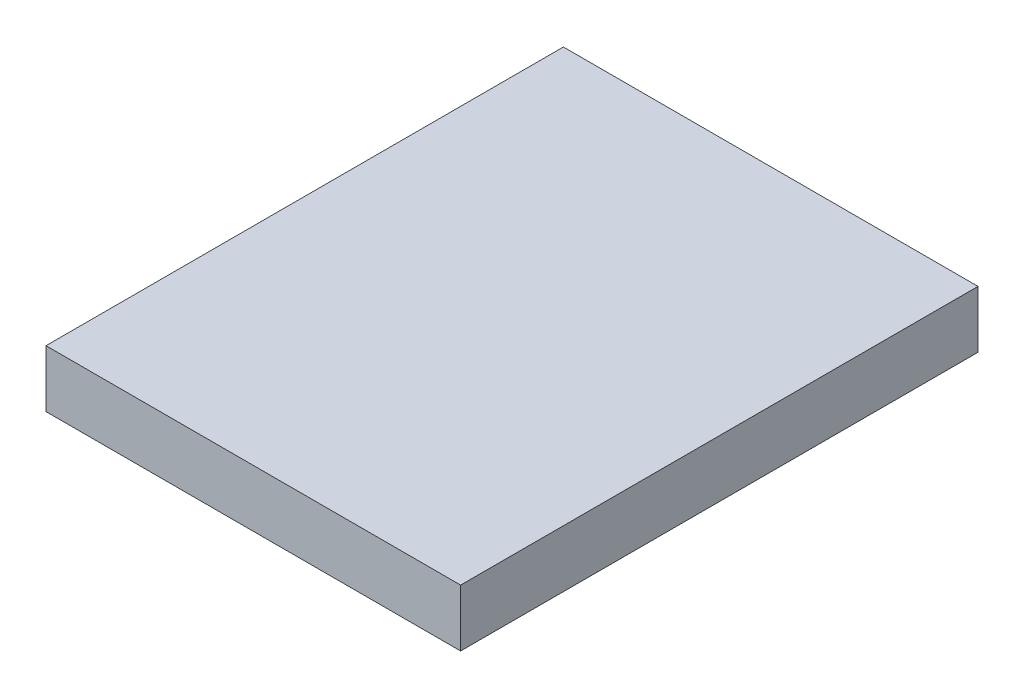
ISO-10303-21;
HEADER;
FILE_DESCRIPTION(('STEP AP214'),'2;1');
FILE_NAME('part.step','',(''),(''),'','','');
FILE_SCHEMA(('AUTOMOTIVE_DESIGN { 1 0 10303 214 1 1 1 1 }'));
ENDSEC;
DATA;
#1=APPLICATION_CONTEXT('core data for automotive mechanical design processes');
#2=APPLICATION_PROTOCOL_DEFINITION('international standard','automotive_design',2000,#1);
#3=PRODUCT_CONTEXT('',#1,'mechanical');
#4=PRODUCT('Part','Part','',(#3));
#5=PRODUCT_RELATED_PRODUCT_CATEGORY('part','',(#4));
#6=PRODUCT_DEFINITION_FORMATION('','',#4);
#7=PRODUCT_DEFINITION_CONTEXT('part definition',#1,'design');
#8=PRODUCT_DEFINITION('design','',#6,#7);
#9=PRODUCT_DEFINITION_SHAPE('','',#8);
#10=(LENGTH_UNIT() NAMED_UNIT(*) SI_UNIT(.MILLI.,.METRE.));
#11=(NAMED_UNIT(*) PLANE_ANGLE_UNIT() SI_UNIT($,.RADIAN.));
#12=(NAMED_UNIT(*) SI_UNIT($,.STERADIAN.) SOLID_ANGLE_UNIT());
#13=UNCERTAINTY_MEASURE_WITH_UNIT(LENGTH_MEASURE(1.E-05),#10,'distance_accuracy_value','');
#14=(GEOMETRIC_REPRESENTATION_CONTEXT(3) GLOBAL_UNCERTAINTY_ASSIGNED_CONTEXT((#13)) GLOBAL_UNIT_ASSIGNED_CONTEXT((#10,
#11,#12)) REPRESENTATION_CONTEXT('',''));
#15=CARTESIAN_POINT('',(0.,0.,0.));
#16=DIRECTION('',(0.,0.,1.));
#17=DIRECTION('',(1.,0.,0.));
#18=AXIS2_PLACEMENT_3D('',#15,#16,#17);
#19=CARTESIAN_POINT('',(5.80999999999999,0.8,-7.25));
#20=DIRECTION('',(-1.,0.,0.));
#21=DIRECTION('',(0.,0.,1.));
#22=AXIS2_PLACEMENT_3D('',#19,#20,#21);
#23=PLANE('',#22);
#24=DIRECTION('',(0.,0.,-1.));
#25=VECTOR('',#24,1.);
#26=CARTESIAN_POINT('',(5.80999999999999,-0.8,-7.25));
#27=LINE('',#26,#25);
#28=CARTESIAN_POINT('',(5.80999999999999,-0.8,7.25));
#29=VERTEX_POINT('',#28);
#30=CARTESIAN_POINT('',(5.80999999999999,-0.8,-7.25));
#31=VERTEX_POINT('',#30);
#32=EDGE_CURVE('E109',#29,#31,#27,.T.);
#33=ORIENTED_EDGE('',*,*,#32,.T.);
#34=DIRECTION('',(0.,-1.,0.));
#35=VECTOR('',#34,1.);
#36=CARTESIAN_POINT('',(5.80999999999999,0.8,-7.25));
#37=LINE('',#36,#35);
#38=CARTESIAN_POINT('',(5.80999999999999,0.8,-7.25));
#39=VERTEX_POINT('',#38);
#40=EDGE_CURVE('E11',#39,#31,#37,.T.);
#41=ORIENTED_EDGE('',*,*,#40,.F.);
#42=DIRECTION('',(0.,0.,-1.));
#43=VECTOR('',#42,1.);
#44=CARTESIAN_POINT('',(5.80999999999999,0.8,-7.25));
#45=LINE('',#44,#43);
#46=CARTESIAN_POINT('',(5.80999999999999,0.8,7.25));
#47=VERTEX_POINT('',#46);
#48=EDGE_CURVE('E93',#47,#39,#45,.T.);
#49=ORIENTED_EDGE('',*,*,#48,.F.);
#50=DIRECTION('',(0.,-1.,0.));
#51=VECTOR('',#50,1.);
#52=CARTESIAN_POINT('',(5.80999999999999,0.8,7.25));
#53=LINE('',#52,#51);
#54=EDGE_CURVE('E105',#47,#29,#53,.T.);
#55=ORIENTED_EDGE('',*,*,#54,.T.);
#56=EDGE_LOOP('',(#33,#41,#49,#55));
#57=FACE_BOUND('',#56,.T.);
#58=ADVANCED_FACE('F41',(#57),#23,.F.);
#59=CARTESIAN_POINT('',(-5.81,0.8,-7.25));
#60=DIRECTION('',(0.,0.,1.));
#61=DIRECTION('',(1.,0.,0.));
#62=AXIS2_PLACEMENT_3D('',#59,#60,#61);
#63=PLANE('',#62);
#64=DIRECTION('',(-1.,0.,0.));
#65=VECTOR('',#64,1.);
#66=CARTESIAN_POINT('',(-5.81,-0.8,-7.25));
#67=LINE('',#66,#65);
#68=CARTESIAN_POINT('',(-5.81,-0.8,-7.25));
#69=VERTEX_POINT('',#68);
#70=EDGE_CURVE('E98',#31,#69,#67,.T.);
#71=ORIENTED_EDGE('',*,*,#70,.T.);
#72=DIRECTION('',(0.,-1.,0.));
#73=VECTOR('',#72,1.);
#74=CARTESIAN_POINT('',(-5.81,0.8,-7.25));
#75=LINE('',#74,#73);
#76=CARTESIAN_POINT('',(-5.81,0.8,-7.25));
#77=VERTEX_POINT('',#76);
#78=EDGE_CURVE('E50',#77,#69,#75,.T.);
#79=ORIENTED_EDGE('',*,*,#78,.F.);
#80=DIRECTION('',(-1.,0.,0.));
#81=VECTOR('',#80,1.);
#82=CARTESIAN_POINT('',(-5.81,0.8,-7.25));
#83=LINE('',#82,#81);
#84=EDGE_CURVE('E88',#39,#77,#83,.T.);
#85=ORIENTED_EDGE('',*,*,#84,.F.);
#86=ORIENTED_EDGE('',*,*,#40,.T.);
#87=EDGE_LOOP('',(#71,#79,#85,#86));
#88=FACE_BOUND('',#87,.T.);
#89=ADVANCED_FACE('F97',(#88),#63,.F.);
#90=CARTESIAN_POINT('',(-5.81,0.8,-7.25));
#91=DIRECTION('',(1.,0.,0.));
#92=DIRECTION('',(0.,0.,-1.));
#93=AXIS2_PLACEMENT_3D('',#90,#91,#92);
#94=PLANE('',#93);
#95=DIRECTION('',(0.,0.,1.));
#96=VECTOR('',#95,1.);
#97=CARTESIAN_POINT('',(-5.81,-0.8,-7.25));
#98=LINE('',#97,#96);
#99=CARTESIAN_POINT('',(-5.81,-0.8,7.25));
#100=VERTEX_POINT('',#99);
#101=EDGE_CURVE('E75',#69,#100,#98,.T.);
#102=ORIENTED_EDGE('',*,*,#101,.T.);
#103=DIRECTION('',(0.,-1.,0.));
#104=VECTOR('',#103,1.);
#105=CARTESIAN_POINT('',(-5.81,0.8,7.25));
#106=LINE('',#105,#104);
#107=CARTESIAN_POINT('',(-5.81,0.8,7.25));
#108=VERTEX_POINT('',#107);
#109=EDGE_CURVE('E100',#108,#100,#106,.T.);
#110=ORIENTED_EDGE('',*,*,#109,.F.);
#111=DIRECTION('',(0.,0.,1.));
#112=VECTOR('',#111,1.);
#113=CARTESIAN_POINT('',(-5.81,0.8,-7.25));
#114=LINE('',#113,#112);
#115=EDGE_CURVE('E91',#77,#108,#114,.T.);
#116=ORIENTED_EDGE('',*,*,#115,.F.);
#117=ORIENTED_EDGE('',*,*,#78,.T.);
#118=EDGE_LOOP('',(#102,#110,#116,#117));
#119=FACE_BOUND('',#118,.T.);
#120=ADVANCED_FACE('F101',(#119),#94,.F.);
#121=CARTESIAN_POINT('',(-5.81,0.8,7.25));
#122=DIRECTION('',(0.,0.,-1.));
#123=DIRECTION('',(-1.,0.,0.));
#124=AXIS2_PLACEMENT_3D('',#121,#122,#123);
#125=PLANE('',#124);
#126=DIRECTION('',(1.,0.,0.));
#127=VECTOR('',#126,1.);
#128=CARTESIAN_POINT('',(-5.81,-0.8,7.25));
#129=LINE('',#128,#127);
#130=EDGE_CURVE('E81',#100,#29,#129,.T.);
#131=ORIENTED_EDGE('',*,*,#130,.T.);
#132=ORIENTED_EDGE('',*,*,#54,.F.);
#133=DIRECTION('',(1.,0.,0.));
#134=VECTOR('',#133,1.);
#135=CARTESIAN_POINT('',(-5.81,0.8,7.25));
#136=LINE('',#135,#134);
#137=EDGE_CURVE('E58',#108,#47,#136,.T.);
#138=ORIENTED_EDGE('',*,*,#137,.F.);
#139=ORIENTED_EDGE('',*,*,#109,.T.);
#140=EDGE_LOOP('',(#131,#132,#138,#139));
#141=FACE_BOUND('',#140,.T.);
#142=ADVANCED_FACE('F122',(#141),#125,.F.);
#143=CARTESIAN_POINT('',(0.,0.8,0.));
#144=DIRECTION('',(0.,1.,0.));
#145=DIRECTION('',(0.,0.,1.));
#146=AXIS2_PLACEMENT_3D('',#143,#144,#145);
#147=PLANE('',#146);
#148=ORIENTED_EDGE('',*,*,#48,.T.);
#149=ORIENTED_EDGE('',*,*,#84,.T.);
#150=ORIENTED_EDGE('',*,*,#115,.T.);
#151=ORIENTED_EDGE('',*,*,#137,.T.);
#152=EDGE_LOOP('',(#148,#149,#150,#151));
#153=FACE_BOUND('',#152,.T.);
#154=ADVANCED_FACE('F89',(#153),#147,.T.);
#155=CARTESIAN_POINT('',(0.,-0.8,0.));
#156=DIRECTION('',(0.,1.,0.));
#157=DIRECTION('',(0.,0.,1.));
#158=AXIS2_PLACEMENT_3D('',#155,#156,#157);
#159=PLANE('',#158);
#160=ORIENTED_EDGE('',*,*,#32,.F.);
#161=ORIENTED_EDGE('',*,*,#130,.F.);
#162=ORIENTED_EDGE('',*,*,#101,.F.);
#163=ORIENTED_EDGE('',*,*,#70,.F.);
#164=EDGE_LOOP('',(#160,#161,#162,#163));
#165=FACE_BOUND('',#164,.T.);
#166=ADVANCED_FACE('F125',(#165),#159,.F.);
#167=CLOSED_SHELL('',(#58,#89,#120,#142,#154,#166));
#168=MANIFOLD_SOLID_BREP('B2',#167);
#169=ADVANCED_BREP_SHAPE_REPRESENTATION('',(#18,#168),#14);
#170=SHAPE_DEFINITION_REPRESENTATION(#9,#169);
ENDSEC;
END-ISO-10303-21;
